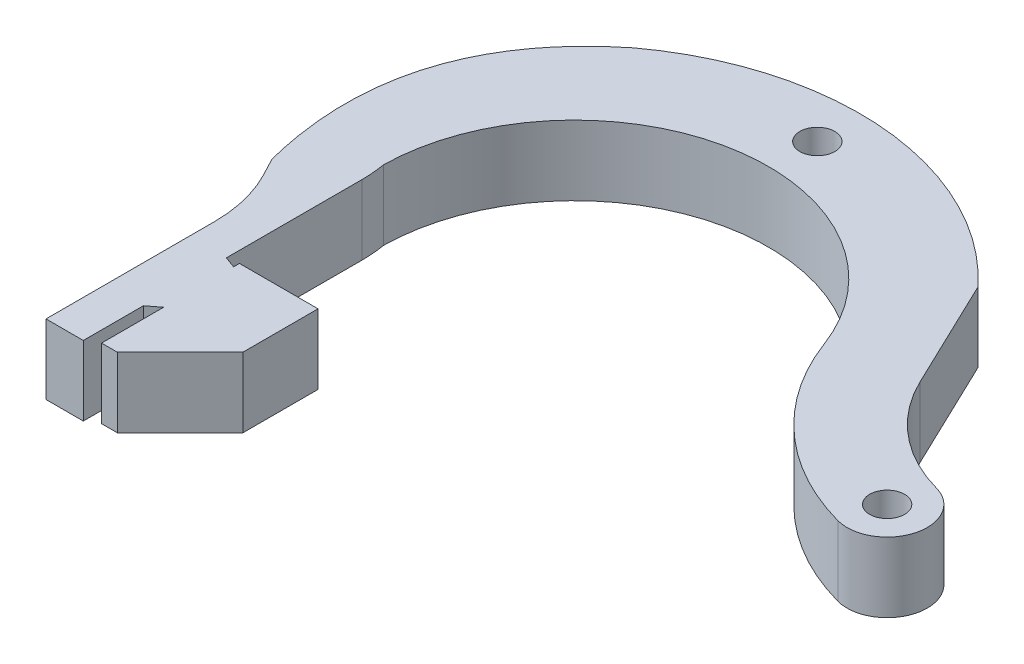
ISO-10303-21;
HEADER;
FILE_DESCRIPTION(('STEP AP214'),'2;1');
FILE_NAME('part.step','',(''),(''),'','','');
FILE_SCHEMA(('AUTOMOTIVE_DESIGN { 1 0 10303 214 1 1 1 1 }'));
ENDSEC;
DATA;
#1=APPLICATION_CONTEXT('core data for automotive mechanical design processes');
#2=APPLICATION_PROTOCOL_DEFINITION('international standard','automotive_design',2000,#1);
#3=PRODUCT_CONTEXT('',#1,'mechanical');
#4=PRODUCT('Part','Part','',(#3));
#5=PRODUCT_RELATED_PRODUCT_CATEGORY('part','',(#4));
#6=PRODUCT_DEFINITION_FORMATION('','',#4);
#7=PRODUCT_DEFINITION_CONTEXT('part definition',#1,'design');
#8=PRODUCT_DEFINITION('design','',#6,#7);
#9=PRODUCT_DEFINITION_SHAPE('','',#8);
#10=(LENGTH_UNIT() NAMED_UNIT(*) SI_UNIT(.MILLI.,.METRE.));
#11=(NAMED_UNIT(*) PLANE_ANGLE_UNIT() SI_UNIT($,.RADIAN.));
#12=(NAMED_UNIT(*) SI_UNIT($,.STERADIAN.) SOLID_ANGLE_UNIT());
#13=UNCERTAINTY_MEASURE_WITH_UNIT(LENGTH_MEASURE(1.E-05),#10,'distance_accuracy_value','');
#14=(GEOMETRIC_REPRESENTATION_CONTEXT(3) GLOBAL_UNCERTAINTY_ASSIGNED_CONTEXT((#13)) GLOBAL_UNIT_ASSIGNED_CONTEXT((#10,
#11,#12)) REPRESENTATION_CONTEXT('',''));
#15=CARTESIAN_POINT('',(0.,0.,0.));
#16=DIRECTION('',(0.,0.,1.));
#17=DIRECTION('',(1.,0.,0.));
#18=AXIS2_PLACEMENT_3D('',#15,#16,#17);
#19=CARTESIAN_POINT('',(-27.8836472437135,10.,9.98188058205765));
#20=DIRECTION('',(-1.,0.,0.));
#21=DIRECTION('',(0.,0.,1.));
#22=AXIS2_PLACEMENT_3D('',#19,#20,#21);
#23=PLANE('',#22);
#24=DIRECTION('',(0.,1.,0.));
#25=VECTOR('',#24,1.);
#26=CARTESIAN_POINT('',(-27.8836472437135,10.,-10.5070045772254));
#27=LINE('',#26,#25);
#28=CARTESIAN_POINT('',(-27.8836472437135,0.,-10.5070045772254));
#29=VERTEX_POINT('',#28);
#30=CARTESIAN_POINT('',(-27.8836472437135,10.,-10.5070045772254));
#31=VERTEX_POINT('',#30);
#32=EDGE_CURVE('E11',#29,#31,#27,.T.);
#33=ORIENTED_EDGE('',*,*,#32,.F.);
#34=DIRECTION('',(0.,0.,-1.));
#35=VECTOR('',#34,1.);
#36=CARTESIAN_POINT('',(-27.8836472437135,0.,9.98188058205765));
#37=LINE('',#36,#35);
#38=CARTESIAN_POINT('',(-27.8836472437135,0.,-29.9252817788235));
#39=VERTEX_POINT('',#38);
#40=EDGE_CURVE('E348',#29,#39,#37,.T.);
#41=ORIENTED_EDGE('',*,*,#40,.T.);
#42=DIRECTION('',(0.,-1.,0.));
#43=VECTOR('',#42,1.);
#44=CARTESIAN_POINT('',(-27.8836472437135,10.,-29.9252817788235));
#45=LINE('',#44,#43);
#46=CARTESIAN_POINT('',(-27.8836472437135,10.,-29.9252817788235));
#47=VERTEX_POINT('',#46);
#48=EDGE_CURVE('E352',#47,#39,#45,.T.);
#49=ORIENTED_EDGE('',*,*,#48,.F.);
#50=DIRECTION('',(0.,0.,-1.));
#51=VECTOR('',#50,1.);
#52=CARTESIAN_POINT('',(-27.8836472437135,10.,9.98188058205765));
#53=LINE('',#52,#51);
#54=EDGE_CURVE('E61',#31,#47,#53,.T.);
#55=ORIENTED_EDGE('',*,*,#54,.F.);
#56=EDGE_LOOP('',(#33,#41,#49,#55));
#57=FACE_BOUND('',#56,.T.);
#58=ADVANCED_FACE('F45',(#57),#23,.F.);
#59=DIRECTION('',(0.,-1.,0.));
#60=VECTOR('',#59,1.);
#61=CARTESIAN_POINT('',(-27.8836472437135,10.,1.36486148575647));
#62=LINE('',#61,#60);
#63=CARTESIAN_POINT('',(-27.8836472437135,10.,1.36486148575647));
#64=VERTEX_POINT('',#63);
#65=CARTESIAN_POINT('',(-27.8836472437135,0.,1.36486148575647));
#66=VERTEX_POINT('',#65);
#67=EDGE_CURVE('E54',#64,#66,#62,.T.);
#68=ORIENTED_EDGE('',*,*,#67,.F.);
#69=CARTESIAN_POINT('',(-27.8836472437135,10.,9.98188058205765));
#70=VERTEX_POINT('',#69);
#71=EDGE_CURVE('E255',#70,#64,#53,.T.);
#72=ORIENTED_EDGE('',*,*,#71,.F.);
#73=DIRECTION('',(0.,-1.,0.));
#74=VECTOR('',#73,1.);
#75=CARTESIAN_POINT('',(-27.8836472437135,10.,9.98188058205765));
#76=LINE('',#75,#74);
#77=CARTESIAN_POINT('',(-27.8836472437135,0.,9.98188058205765));
#78=VERTEX_POINT('',#77);
#79=EDGE_CURVE('E340',#70,#78,#76,.T.);
#80=ORIENTED_EDGE('',*,*,#79,.T.);
#81=EDGE_CURVE('E350',#78,#66,#37,.T.);
#82=ORIENTED_EDGE('',*,*,#81,.T.);
#83=EDGE_LOOP('',(#68,#72,#80,#82));
#84=FACE_BOUND('',#83,.T.);
#85=ADVANCED_FACE('F328',(#84),#23,.F.);
#86=CARTESIAN_POINT('',(-53.2263422322523,10.,-14.1708076967114));
#87=DIRECTION('',(0.,1.,0.));
#88=DIRECTION('',(0.,0.,1.));
#89=AXIS2_PLACEMENT_3D('',#86,#87,#88);
#90=PLANE('',#89);
#91=DIRECTION('',(-0.939615015171803,0.,-0.342233287778515));
#92=VECTOR('',#91,1.);
#93=CARTESIAN_POINT('',(-26.25,10.,-9.9119859171796));
#94=LINE('',#93,#92);
#95=CARTESIAN_POINT('',(-26.25,10.,-9.9119859171796));
#96=VERTEX_POINT('',#95);
#97=EDGE_CURVE('E195',#96,#31,#94,.T.);
#98=ORIENTED_EDGE('',*,*,#97,.T.);
#99=ORIENTED_EDGE('',*,*,#54,.T.);
#100=CARTESIAN_POINT('',(-47.8836472437136,10.,-29.9252817788235));
#101=DIRECTION('',(0.,1.,0.));
#102=DIRECTION('',(0.,0.,1.));
#103=AXIS2_PLACEMENT_3D('',#100,#101,#102);
#104=CIRCLE('',#103,20.);
#105=CARTESIAN_POINT('',(-28.1744901854838,10.,-33.3236825871495));
#106=VERTEX_POINT('',#105);
#107=EDGE_CURVE('E258',#47,#106,#104,.T.);
#108=ORIENTED_EDGE('',*,*,#107,.T.);
#109=CARTESIAN_POINT('',(-0.403753825224743,10.,-32.8879581539375));
#110=DIRECTION('',(0.,-1.,0.));
#111=DIRECTION('',(0.,0.,1.));
#112=AXIS2_PLACEMENT_3D('',#109,#110,#111);
#113=CIRCLE('',#112,27.7741544204808);
#114=CARTESIAN_POINT('',(25.6149759747366,10.,-42.6054348515848));
#115=VERTEX_POINT('',#114);
#116=EDGE_CURVE('E261',#106,#115,#113,.T.);
#117=ORIENTED_EDGE('',*,*,#116,.T.);
#118=CARTESIAN_POINT('',(57.4782918402877,10.,-54.5057478881469));
#119=DIRECTION('',(0.,1.,0.));
#120=DIRECTION('',(0.,0.,-1.));
#121=AXIS2_PLACEMENT_3D('',#118,#119,#120);
#122=CIRCLE('',#121,34.0130614369841);
#123=CARTESIAN_POINT('',(48.4785732367483,10.,-21.7049336700034));
#124=VERTEX_POINT('',#123);
#125=EDGE_CURVE('E264',#115,#124,#122,.T.);
#126=ORIENTED_EDGE('',*,*,#125,.T.);
#127=CARTESIAN_POINT('',(50.,10.,-27.25));
#128=DIRECTION('',(0.,1.,0.));
#129=DIRECTION('',(0.,0.,-1.));
#130=AXIS2_PLACEMENT_3D('',#127,#128,#129);
#131=CIRCLE('',#130,5.75);
#132=CARTESIAN_POINT('',(51.5214267632517,10.,-32.7950663299966));
#133=VERTEX_POINT('',#132);
#134=EDGE_CURVE('E267',#124,#133,#131,.T.);
#135=ORIENTED_EDGE('',*,*,#134,.T.);
#136=CARTESIAN_POINT('',(57.4782918402877,10.,-54.5057478881469));
#137=DIRECTION('',(0.,-1.,0.));
#138=DIRECTION('',(0.,0.,-1.));
#139=AXIS2_PLACEMENT_3D('',#136,#137,#138);
#140=CIRCLE('',#139,22.5130614369841);
#141=CARTESIAN_POINT('',(37.1739270964411,10.,-44.7810007133222));
#142=VERTEX_POINT('',#141);
#143=EDGE_CURVE('E270',#133,#142,#140,.T.);
#144=ORIENTED_EDGE('',*,*,#143,.T.);
#145=DIRECTION('',(-0.431960229045037,0.,-0.901892654656506));
#146=VECTOR('',#145,1.);
#147=CARTESIAN_POINT('',(37.1739270964411,10.,-44.7810007133222));
#148=LINE('',#147,#146);
#149=CARTESIAN_POINT('',(29.5444533086446,10.,-60.710630122308));
#150=VERTEX_POINT('',#149);
#151=EDGE_CURVE('E273',#142,#150,#148,.T.);
#152=ORIENTED_EDGE('',*,*,#151,.T.);
#153=CARTESIAN_POINT('',(-0.403753825224743,10.,-32.8879581539375));
#154=DIRECTION('',(0.,1.,0.));
#155=DIRECTION('',(0.,0.,1.));
#156=AXIS2_PLACEMENT_3D('',#153,#154,#155);
#157=CIRCLE('',#156,40.8778202206611);
#158=CARTESIAN_POINT('',(-24.8018942816884,10.,-65.6862344540628));
#159=VERTEX_POINT('',#158);
#160=EDGE_CURVE('E276',#150,#159,#157,.T.);
#161=ORIENTED_EDGE('',*,*,#160,.T.);
#162=CARTESIAN_POINT('',(-24.8018942816884,10.,-65.6862344540628));
#163=CARTESIAN_POINT('',(-43.2247945246152,10.,-50.9575823740122));
#164=CARTESIAN_POINT('',(-36.8668421446019,10.,-26.0214736730353));
#165=B_SPLINE_CURVE_WITH_KNOTS('',2,(#162,#163,#164),.UNSPECIFIED.,.F.,.F.,(3,3),(0.,1.),.UNSPECIFIED.);
#166=CARTESIAN_POINT('',(-36.8668421446019,10.,-26.0214736730353));
#167=VERTEX_POINT('',#166);
#168=EDGE_CURVE('E279',#159,#167,#165,.T.);
#169=ORIENTED_EDGE('',*,*,#168,.T.);
#170=DIRECTION('',(0.46691635712828,0.,0.884301484475773));
#171=VECTOR('',#170,1.);
#172=CARTESIAN_POINT('',(-35.5403125427369,10.,-23.509134839277));
#173=LINE('',#172,#171);
#174=CARTESIAN_POINT('',(-35.5403125427369,10.,-23.509134839277));
#175=VERTEX_POINT('',#174);
#176=EDGE_CURVE('E285',#167,#175,#173,.T.);
#177=ORIENTED_EDGE('',*,*,#176,.T.);
#178=CARTESIAN_POINT('',(-53.2263422322523,10.,-14.1708076967114));
#179=DIRECTION('',(0.,-1.,0.));
#180=DIRECTION('',(0.,0.,1.));
#181=AXIS2_PLACEMENT_3D('',#178,#179,#180);
#182=CIRCLE('',#181,20.);
#183=CARTESIAN_POINT('',(-33.2263422322523,10.,-14.1708076967113));
#184=VERTEX_POINT('',#183);
#185=EDGE_CURVE('E402',#175,#184,#182,.T.);
#186=ORIENTED_EDGE('',*,*,#185,.T.);
#187=DIRECTION('',(0.,0.,1.));
#188=VECTOR('',#187,1.);
#189=CARTESIAN_POINT('',(-33.2263422322523,10.,9.98188058205765));
#190=LINE('',#189,#188);
#191=CARTESIAN_POINT('',(-33.2263422322523,10.,9.98188058205765));
#192=VERTEX_POINT('',#191);
#193=EDGE_CURVE('E247',#184,#192,#190,.T.);
#194=ORIENTED_EDGE('',*,*,#193,.T.);
#195=DIRECTION('',(1.,0.,0.));
#196=VECTOR('',#195,1.);
#197=CARTESIAN_POINT('',(-33.2263422322523,10.,9.98188058205765));
#198=LINE('',#197,#196);
#199=EDGE_CURVE('E251',#192,#70,#198,.T.);
#200=ORIENTED_EDGE('',*,*,#199,.T.);
#201=ORIENTED_EDGE('',*,*,#71,.T.);
#202=DIRECTION('',(0.794045902338125,0.,-0.607857799966434));
#203=VECTOR('',#202,1.);
#204=CARTESIAN_POINT('',(-29.4384156793673,10.,2.55506738943392));
#205=LINE('',#204,#203);
#206=CARTESIAN_POINT('',(-26.25,10.,0.114272298707066));
#207=VERTEX_POINT('',#206);
#208=EDGE_CURVE('E204',#64,#207,#205,.T.);
#209=ORIENTED_EDGE('',*,*,#208,.T.);
#210=DIRECTION('',(0.,0.,1.));
#211=VECTOR('',#210,1.);
#212=CARTESIAN_POINT('',(-26.25,10.,9.));
#213=LINE('',#212,#211);
#214=CARTESIAN_POINT('',(-26.25,10.,9.));
#215=VERTEX_POINT('',#214);
#216=EDGE_CURVE('E449',#207,#215,#213,.T.);
#217=ORIENTED_EDGE('',*,*,#216,.T.);
#218=DIRECTION('',(1.,0.,0.));
#219=VECTOR('',#218,1.);
#220=CARTESIAN_POINT('',(-23.984756922729,10.,9.));
#221=LINE('',#220,#219);
#222=CARTESIAN_POINT('',(-23.984756922729,10.,9.));
#223=VERTEX_POINT('',#222);
#224=EDGE_CURVE('E452',#215,#223,#221,.T.);
#225=ORIENTED_EDGE('',*,*,#224,.T.);
#226=DIRECTION('',(0.706507215278727,0.,-0.707705839144414));
#227=VECTOR('',#226,1.);
#228=CARTESIAN_POINT('',(-15.,10.,0.));
#229=LINE('',#228,#227);
#230=CARTESIAN_POINT('',(-15.,10.,0.));
#231=VERTEX_POINT('',#230);
#232=EDGE_CURVE('E457',#223,#231,#229,.T.);
#233=ORIENTED_EDGE('',*,*,#232,.T.);
#234=DIRECTION('',(0.,0.,-1.));
#235=VECTOR('',#234,1.);
#236=CARTESIAN_POINT('',(-15.,10.,-10.75));
#237=LINE('',#236,#235);
#238=CARTESIAN_POINT('',(-15.,10.,-10.75));
#239=VERTEX_POINT('',#238);
#240=EDGE_CURVE('E460',#231,#239,#237,.T.);
#241=ORIENTED_EDGE('',*,*,#240,.T.);
#242=DIRECTION('',(-1.,0.,0.));
#243=VECTOR('',#242,1.);
#244=CARTESIAN_POINT('',(-26.25,10.,-10.75));
#245=LINE('',#244,#243);
#246=CARTESIAN_POINT('',(-26.25,10.,-10.75));
#247=VERTEX_POINT('',#246);
#248=EDGE_CURVE('E211',#239,#247,#245,.T.);
#249=ORIENTED_EDGE('',*,*,#248,.T.);
#250=DIRECTION('',(0.,0.,1.));
#251=VECTOR('',#250,1.);
#252=CARTESIAN_POINT('',(-26.25,10.,-10.75));
#253=LINE('',#252,#251);
#254=EDGE_CURVE('E205',#247,#96,#253,.T.);
#255=ORIENTED_EDGE('',*,*,#254,.T.);
#256=EDGE_LOOP('',(#98,#99,#108,#117,#126,#135,#144,#152,#161,#169,#177,#186,#194,#200,#201,
#209,#217,#225,#233,#241,#249,#255));
#257=FACE_BOUND('',#256,.T.);
#258=CARTESIAN_POINT('',(0.,10.,-67.25));
#259=DIRECTION('',(0.,1.,0.));
#260=DIRECTION('',(0.,0.,1.));
#261=AXIS2_PLACEMENT_3D('',#258,#259,#260);
#262=CIRCLE('',#261,2.5);
#263=CARTESIAN_POINT('',(0.,10.,-64.75));
#264=VERTEX_POINT('',#263);
#265=EDGE_CURVE('E239',#264,#264,#262,.T.);
#266=ORIENTED_EDGE('',*,*,#265,.F.);
#267=EDGE_LOOP('',(#266));
#268=FACE_BOUND('',#267,.T.);
#269=CARTESIAN_POINT('',(50.,10.,-27.25));
#270=DIRECTION('',(0.,1.,0.));
#271=DIRECTION('',(0.,0.,1.));
#272=AXIS2_PLACEMENT_3D('',#269,#270,#271);
#273=CIRCLE('',#272,2.5);
#274=CARTESIAN_POINT('',(50.,10.,-24.75));
#275=VERTEX_POINT('',#274);
#276=EDGE_CURVE('E228',#275,#275,#273,.T.);
#277=ORIENTED_EDGE('',*,*,#276,.F.);
#278=EDGE_LOOP('',(#277));
#279=FACE_BOUND('',#278,.T.);
#280=ADVANCED_FACE('F208',(#257,#268,#279),#90,.T.);
#281=CARTESIAN_POINT('',(-53.2263422322523,0.,-14.1708076967114));
#282=DIRECTION('',(0.,1.,0.));
#283=DIRECTION('',(0.,0.,1.));
#284=AXIS2_PLACEMENT_3D('',#281,#282,#283);
#285=PLANE('',#284);
#286=ORIENTED_EDGE('',*,*,#40,.F.);
#287=DIRECTION('',(-0.939615015171803,0.,-0.342233287778515));
#288=VECTOR('',#287,1.);
#289=CARTESIAN_POINT('',(-26.25,0.,-9.9119859171796));
#290=LINE('',#289,#288);
#291=CARTESIAN_POINT('',(-26.25,0.,-9.9119859171796));
#292=VERTEX_POINT('',#291);
#293=EDGE_CURVE('E468',#292,#29,#290,.T.);
#294=ORIENTED_EDGE('',*,*,#293,.F.);
#295=DIRECTION('',(0.,0.,1.));
#296=VECTOR('',#295,1.);
#297=CARTESIAN_POINT('',(-26.25,0.,-10.75));
#298=LINE('',#297,#296);
#299=CARTESIAN_POINT('',(-26.25,0.,-10.75));
#300=VERTEX_POINT('',#299);
#301=EDGE_CURVE('E220',#300,#292,#298,.T.);
#302=ORIENTED_EDGE('',*,*,#301,.F.);
#303=DIRECTION('',(-1.,0.,0.));
#304=VECTOR('',#303,1.);
#305=CARTESIAN_POINT('',(-26.25,0.,-10.75));
#306=LINE('',#305,#304);
#307=CARTESIAN_POINT('',(-15.,0.,-10.75));
#308=VERTEX_POINT('',#307);
#309=EDGE_CURVE('E216',#308,#300,#306,.T.);
#310=ORIENTED_EDGE('',*,*,#309,.F.);
#311=DIRECTION('',(0.,0.,-1.));
#312=VECTOR('',#311,1.);
#313=CARTESIAN_POINT('',(-15.,0.,-10.75));
#314=LINE('',#313,#312);
#315=CARTESIAN_POINT('',(-15.,0.,0.));
#316=VERTEX_POINT('',#315);
#317=EDGE_CURVE('E482',#316,#308,#314,.T.);
#318=ORIENTED_EDGE('',*,*,#317,.F.);
#319=DIRECTION('',(0.706507215278727,0.,-0.707705839144414));
#320=VECTOR('',#319,1.);
#321=CARTESIAN_POINT('',(-15.,0.,0.));
#322=LINE('',#321,#320);
#323=CARTESIAN_POINT('',(-23.984756922729,0.,9.));
#324=VERTEX_POINT('',#323);
#325=EDGE_CURVE('E479',#324,#316,#322,.T.);
#326=ORIENTED_EDGE('',*,*,#325,.F.);
#327=DIRECTION('',(1.,0.,0.));
#328=VECTOR('',#327,1.);
#329=CARTESIAN_POINT('',(-23.984756922729,0.,9.));
#330=LINE('',#329,#328);
#331=CARTESIAN_POINT('',(-26.25,0.,9.));
#332=VERTEX_POINT('',#331);
#333=EDGE_CURVE('E476',#332,#324,#330,.T.);
#334=ORIENTED_EDGE('',*,*,#333,.F.);
#335=DIRECTION('',(0.,0.,1.));
#336=VECTOR('',#335,1.);
#337=CARTESIAN_POINT('',(-26.25,0.,9.));
#338=LINE('',#337,#336);
#339=CARTESIAN_POINT('',(-26.25,0.,0.114272298707066));
#340=VERTEX_POINT('',#339);
#341=EDGE_CURVE('E473',#340,#332,#338,.T.);
#342=ORIENTED_EDGE('',*,*,#341,.F.);
#343=DIRECTION('',(0.794045902338125,0.,-0.607857799966434));
#344=VECTOR('',#343,1.);
#345=CARTESIAN_POINT('',(-29.4384156793673,0.,2.55506738943392));
#346=LINE('',#345,#344);
#347=EDGE_CURVE('E357',#66,#340,#346,.T.);
#348=ORIENTED_EDGE('',*,*,#347,.F.);
#349=ORIENTED_EDGE('',*,*,#81,.F.);
#350=DIRECTION('',(1.,0.,0.));
#351=VECTOR('',#350,1.);
#352=CARTESIAN_POINT('',(-33.2263422322523,0.,9.98188058205765));
#353=LINE('',#352,#351);
#354=CARTESIAN_POINT('',(-33.2263422322523,0.,9.98188058205765));
#355=VERTEX_POINT('',#354);
#356=EDGE_CURVE('E338',#355,#78,#353,.T.);
#357=ORIENTED_EDGE('',*,*,#356,.F.);
#358=DIRECTION('',(0.,0.,1.));
#359=VECTOR('',#358,1.);
#360=CARTESIAN_POINT('',(-33.2263422322523,0.,9.98188058205765));
#361=LINE('',#360,#359);
#362=CARTESIAN_POINT('',(-33.2263422322523,0.,-14.1708076967113));
#363=VERTEX_POINT('',#362);
#364=EDGE_CURVE('E243',#363,#355,#361,.T.);
#365=ORIENTED_EDGE('',*,*,#364,.F.);
#366=CARTESIAN_POINT('',(-53.2263422322523,0.,-14.1708076967114));
#367=DIRECTION('',(0.,-1.,0.));
#368=DIRECTION('',(0.,0.,1.));
#369=AXIS2_PLACEMENT_3D('',#366,#367,#368);
#370=CIRCLE('',#369,20.);
#371=CARTESIAN_POINT('',(-35.5403125427369,0.,-23.509134839277));
#372=VERTEX_POINT('',#371);
#373=EDGE_CURVE('E252',#372,#363,#370,.T.);
#374=ORIENTED_EDGE('',*,*,#373,.F.);
#375=DIRECTION('',(0.46691635712828,0.,0.884301484475773));
#376=VECTOR('',#375,1.);
#377=CARTESIAN_POINT('',(-35.5403125427369,0.,-23.509134839277));
#378=LINE('',#377,#376);
#379=CARTESIAN_POINT('',(-36.8668421446019,0.,-26.0214736730353));
#380=VERTEX_POINT('',#379);
#381=EDGE_CURVE('E389',#380,#372,#378,.T.);
#382=ORIENTED_EDGE('',*,*,#381,.F.);
#383=CARTESIAN_POINT('',(-24.8018942816884,0.,-65.6862344540628));
#384=CARTESIAN_POINT('',(-43.2247945246152,0.,-50.9575823740122));
#385=CARTESIAN_POINT('',(-36.8668421446019,0.,-26.0214736730353));
#386=B_SPLINE_CURVE_WITH_KNOTS('',2,(#383,#384,#385),.UNSPECIFIED.,.F.,.F.,(3,3),(0.,1.),.UNSPECIFIED.);
#387=CARTESIAN_POINT('',(-24.8018942816884,0.,-65.6862344540628));
#388=VERTEX_POINT('',#387);
#389=EDGE_CURVE('E384',#388,#380,#386,.T.);
#390=ORIENTED_EDGE('',*,*,#389,.F.);
#391=CARTESIAN_POINT('',(-0.403753825224743,0.,-32.8879581539375));
#392=DIRECTION('',(0.,1.,0.));
#393=DIRECTION('',(0.,0.,1.));
#394=AXIS2_PLACEMENT_3D('',#391,#392,#393);
#395=CIRCLE('',#394,40.8778202206611);
#396=CARTESIAN_POINT('',(29.5444533086446,0.,-60.710630122308));
#397=VERTEX_POINT('',#396);
#398=EDGE_CURVE('E381',#397,#388,#395,.T.);
#399=ORIENTED_EDGE('',*,*,#398,.F.);
#400=DIRECTION('',(-0.431960229045037,0.,-0.901892654656506));
#401=VECTOR('',#400,1.);
#402=CARTESIAN_POINT('',(37.1739270964411,0.,-44.7810007133222));
#403=LINE('',#402,#401);
#404=CARTESIAN_POINT('',(37.1739270964411,0.,-44.7810007133222));
#405=VERTEX_POINT('',#404);
#406=EDGE_CURVE('E378',#405,#397,#403,.T.);
#407=ORIENTED_EDGE('',*,*,#406,.F.);
#408=CARTESIAN_POINT('',(57.4782918402877,0.,-54.5057478881469));
#409=DIRECTION('',(0.,-1.,0.));
#410=DIRECTION('',(0.,0.,-1.));
#411=AXIS2_PLACEMENT_3D('',#408,#409,#410);
#412=CIRCLE('',#411,22.5130614369841);
#413=CARTESIAN_POINT('',(51.5214267632517,0.,-32.7950663299966));
#414=VERTEX_POINT('',#413);
#415=EDGE_CURVE('E375',#414,#405,#412,.T.);
#416=ORIENTED_EDGE('',*,*,#415,.F.);
#417=CARTESIAN_POINT('',(50.,0.,-27.25));
#418=DIRECTION('',(0.,1.,0.));
#419=DIRECTION('',(0.,0.,-1.));
#420=AXIS2_PLACEMENT_3D('',#417,#418,#419);
#421=CIRCLE('',#420,5.75);
#422=CARTESIAN_POINT('',(48.4785732367483,0.,-21.7049336700034));
#423=VERTEX_POINT('',#422);
#424=EDGE_CURVE('E372',#423,#414,#421,.T.);
#425=ORIENTED_EDGE('',*,*,#424,.F.);
#426=CARTESIAN_POINT('',(57.4782918402877,0.,-54.5057478881469));
#427=DIRECTION('',(0.,1.,0.));
#428=DIRECTION('',(0.,0.,-1.));
#429=AXIS2_PLACEMENT_3D('',#426,#427,#428);
#430=CIRCLE('',#429,34.0130614369841);
#431=CARTESIAN_POINT('',(25.6149759747366,0.,-42.6054348515848));
#432=VERTEX_POINT('',#431);
#433=EDGE_CURVE('E369',#432,#423,#430,.T.);
#434=ORIENTED_EDGE('',*,*,#433,.F.);
#435=CARTESIAN_POINT('',(-0.403753825224743,0.,-32.8879581539375));
#436=DIRECTION('',(0.,-1.,0.));
#437=DIRECTION('',(0.,0.,1.));
#438=AXIS2_PLACEMENT_3D('',#435,#436,#437);
#439=CIRCLE('',#438,27.7741544204808);
#440=CARTESIAN_POINT('',(-28.1744901854838,0.,-33.3236825871495));
#441=VERTEX_POINT('',#440);
#442=EDGE_CURVE('E363',#441,#432,#439,.T.);
#443=ORIENTED_EDGE('',*,*,#442,.F.);
#444=CARTESIAN_POINT('',(-47.8836472437136,0.,-29.9252817788235));
#445=DIRECTION('',(0.,1.,0.));
#446=DIRECTION('',(0.,0.,1.));
#447=AXIS2_PLACEMENT_3D('',#444,#445,#446);
#448=CIRCLE('',#447,20.);
#449=EDGE_CURVE('E359',#39,#441,#448,.T.);
#450=ORIENTED_EDGE('',*,*,#449,.F.);
#451=EDGE_LOOP('',(#286,#294,#302,#310,#318,#326,#334,#342,#348,#349,#357,#365,#374,#382,#390,
#399,#407,#416,#425,#434,#443,#450));
#452=FACE_BOUND('',#451,.T.);
#453=CARTESIAN_POINT('',(50.,0.,-27.25));
#454=DIRECTION('',(0.,1.,0.));
#455=DIRECTION('',(0.,0.,1.));
#456=AXIS2_PLACEMENT_3D('',#453,#454,#455);
#457=CIRCLE('',#456,2.5);
#458=CARTESIAN_POINT('',(50.,0.,-24.75));
#459=VERTEX_POINT('',#458);
#460=EDGE_CURVE('E222',#459,#459,#457,.T.);
#461=ORIENTED_EDGE('',*,*,#460,.T.);
#462=EDGE_LOOP('',(#461));
#463=FACE_BOUND('',#462,.T.);
#464=CARTESIAN_POINT('',(0.,0.,-67.25));
#465=DIRECTION('',(0.,1.,0.));
#466=DIRECTION('',(0.,0.,1.));
#467=AXIS2_PLACEMENT_3D('',#464,#465,#466);
#468=CIRCLE('',#467,2.5);
#469=CARTESIAN_POINT('',(0.,0.,-64.75));
#470=VERTEX_POINT('',#469);
#471=EDGE_CURVE('E237',#470,#470,#468,.T.);
#472=ORIENTED_EDGE('',*,*,#471,.T.);
#473=EDGE_LOOP('',(#472));
#474=FACE_BOUND('',#473,.T.);
#475=ADVANCED_FACE('F334',(#452,#463,#474),#285,.F.);
#476=CARTESIAN_POINT('',(-33.2263422322523,10.,9.98188058205765));
#477=DIRECTION('',(1.,0.,0.));
#478=DIRECTION('',(0.,0.,-1.));
#479=AXIS2_PLACEMENT_3D('',#476,#477,#478);
#480=PLANE('',#479);
#481=ORIENTED_EDGE('',*,*,#364,.T.);
#482=DIRECTION('',(0.,-1.,0.));
#483=VECTOR('',#482,1.);
#484=CARTESIAN_POINT('',(-33.2263422322523,10.,9.98188058205765));
#485=LINE('',#484,#483);
#486=EDGE_CURVE('E342',#192,#355,#485,.T.);
#487=ORIENTED_EDGE('',*,*,#486,.F.);
#488=ORIENTED_EDGE('',*,*,#193,.F.);
#489=DIRECTION('',(0.,-1.,0.));
#490=VECTOR('',#489,1.);
#491=CARTESIAN_POINT('',(-33.2263422322523,10.,-14.1708076967113));
#492=LINE('',#491,#490);
#493=EDGE_CURVE('E397',#184,#363,#492,.T.);
#494=ORIENTED_EDGE('',*,*,#493,.T.);
#495=EDGE_LOOP('',(#481,#487,#488,#494));
#496=FACE_BOUND('',#495,.T.);
#497=ADVANCED_FACE('F47',(#496),#480,.F.);
#498=CARTESIAN_POINT('',(-33.2263422322523,10.,9.98188058205765));
#499=DIRECTION('',(0.,0.,-1.));
#500=DIRECTION('',(-1.,0.,0.));
#501=AXIS2_PLACEMENT_3D('',#498,#499,#500);
#502=PLANE('',#501);
#503=ORIENTED_EDGE('',*,*,#356,.T.);
#504=ORIENTED_EDGE('',*,*,#79,.F.);
#505=ORIENTED_EDGE('',*,*,#199,.F.);
#506=ORIENTED_EDGE('',*,*,#486,.T.);
#507=EDGE_LOOP('',(#503,#504,#505,#506));
#508=FACE_BOUND('',#507,.T.);
#509=ADVANCED_FACE('F325',(#508),#502,.F.);
#510=CARTESIAN_POINT('',(-47.8836472437136,10.,-29.9252817788235));
#511=DIRECTION('',(0.,-1.,0.));
#512=DIRECTION('',(0.,0.,-1.));
#513=AXIS2_PLACEMENT_3D('',#510,#511,#512);
#514=CYLINDRICAL_SURFACE('',#513,20.);
#515=ORIENTED_EDGE('',*,*,#449,.T.);
#516=DIRECTION('',(0.,-1.,0.));
#517=VECTOR('',#516,1.);
#518=CARTESIAN_POINT('',(-28.1744901854838,10.,-33.3236825871495));
#519=LINE('',#518,#517);
#520=EDGE_CURVE('E434',#106,#441,#519,.T.);
#521=ORIENTED_EDGE('',*,*,#520,.F.);
#522=ORIENTED_EDGE('',*,*,#107,.F.);
#523=ORIENTED_EDGE('',*,*,#48,.T.);
#524=EDGE_LOOP('',(#515,#521,#522,#523));
#525=FACE_BOUND('',#524,.T.);
#526=ADVANCED_FACE('F321',(#525),#514,.T.);
#527=CARTESIAN_POINT('',(-0.403753825224743,10.,-32.8879581539375));
#528=DIRECTION('',(0.,-1.,0.));
#529=DIRECTION('',(0.,0.,-1.));
#530=AXIS2_PLACEMENT_3D('',#527,#528,#529);
#531=CYLINDRICAL_SURFACE('',#530,27.7741544204808);
#532=ORIENTED_EDGE('',*,*,#442,.T.);
#533=DIRECTION('',(0.,-1.,0.));
#534=VECTOR('',#533,1.);
#535=CARTESIAN_POINT('',(25.6149759747366,10.,-42.6054348515848));
#536=LINE('',#535,#534);
#537=EDGE_CURVE('E430',#115,#432,#536,.T.);
#538=ORIENTED_EDGE('',*,*,#537,.F.);
#539=ORIENTED_EDGE('',*,*,#116,.F.);
#540=ORIENTED_EDGE('',*,*,#520,.T.);
#541=EDGE_LOOP('',(#532,#538,#539,#540));
#542=FACE_BOUND('',#541,.T.);
#543=ADVANCED_FACE('F317',(#542),#531,.F.);
#544=CARTESIAN_POINT('',(57.4782918402877,10.,-54.5057478881469));
#545=DIRECTION('',(0.,-1.,0.));
#546=DIRECTION('',(0.,0.,-1.));
#547=AXIS2_PLACEMENT_3D('',#544,#545,#546);
#548=CYLINDRICAL_SURFACE('',#547,34.0130614369841);
#549=ORIENTED_EDGE('',*,*,#433,.T.);
#550=DIRECTION('',(0.,-1.,0.));
#551=VECTOR('',#550,1.);
#552=CARTESIAN_POINT('',(48.4785732367483,10.,-21.7049336700034));
#553=LINE('',#552,#551);
#554=EDGE_CURVE('E426',#124,#423,#553,.T.);
#555=ORIENTED_EDGE('',*,*,#554,.F.);
#556=ORIENTED_EDGE('',*,*,#125,.F.);
#557=ORIENTED_EDGE('',*,*,#537,.T.);
#558=EDGE_LOOP('',(#549,#555,#556,#557));
#559=FACE_BOUND('',#558,.T.);
#560=ADVANCED_FACE('F313',(#559),#548,.T.);
#561=CARTESIAN_POINT('',(50.,10.,-27.25));
#562=DIRECTION('',(0.,-1.,0.));
#563=DIRECTION('',(0.,0.,-1.));
#564=AXIS2_PLACEMENT_3D('',#561,#562,#563);
#565=CYLINDRICAL_SURFACE('',#564,5.75);
#566=ORIENTED_EDGE('',*,*,#424,.T.);
#567=DIRECTION('',(0.,-1.,0.));
#568=VECTOR('',#567,1.);
#569=CARTESIAN_POINT('',(51.5214267632517,10.,-32.7950663299966));
#570=LINE('',#569,#568);
#571=EDGE_CURVE('E422',#133,#414,#570,.T.);
#572=ORIENTED_EDGE('',*,*,#571,.F.);
#573=ORIENTED_EDGE('',*,*,#134,.F.);
#574=ORIENTED_EDGE('',*,*,#554,.T.);
#575=EDGE_LOOP('',(#566,#572,#573,#574));
#576=FACE_BOUND('',#575,.T.);
#577=ADVANCED_FACE('F309',(#576),#565,.T.);
#578=CARTESIAN_POINT('',(57.4782918402877,10.,-54.5057478881469));
#579=DIRECTION('',(0.,-1.,0.));
#580=DIRECTION('',(0.,0.,-1.));
#581=AXIS2_PLACEMENT_3D('',#578,#579,#580);
#582=CYLINDRICAL_SURFACE('',#581,22.5130614369841);
#583=ORIENTED_EDGE('',*,*,#415,.T.);
#584=DIRECTION('',(0.,-1.,0.));
#585=VECTOR('',#584,1.);
#586=CARTESIAN_POINT('',(37.1739270964411,10.,-44.7810007133222));
#587=LINE('',#586,#585);
#588=EDGE_CURVE('E418',#142,#405,#587,.T.);
#589=ORIENTED_EDGE('',*,*,#588,.F.);
#590=ORIENTED_EDGE('',*,*,#143,.F.);
#591=ORIENTED_EDGE('',*,*,#571,.T.);
#592=EDGE_LOOP('',(#583,#589,#590,#591));
#593=FACE_BOUND('',#592,.T.);
#594=ADVANCED_FACE('F305',(#593),#582,.F.);
#595=CARTESIAN_POINT('',(37.1739270964411,10.,-44.7810007133222));
#596=DIRECTION('',(-0.901892654656506,0.,0.431960229045037));
#597=DIRECTION('',(0.431960229045037,0.,0.901892654656506));
#598=AXIS2_PLACEMENT_3D('',#595,#596,#597);
#599=PLANE('',#598);
#600=ORIENTED_EDGE('',*,*,#406,.T.);
#601=DIRECTION('',(0.,-1.,0.));
#602=VECTOR('',#601,1.);
#603=CARTESIAN_POINT('',(29.5444533086446,10.,-60.710630122308));
#604=LINE('',#603,#602);
#605=EDGE_CURVE('E414',#150,#397,#604,.T.);
#606=ORIENTED_EDGE('',*,*,#605,.F.);
#607=ORIENTED_EDGE('',*,*,#151,.F.);
#608=ORIENTED_EDGE('',*,*,#588,.T.);
#609=EDGE_LOOP('',(#600,#606,#607,#608));
#610=FACE_BOUND('',#609,.T.);
#611=ADVANCED_FACE('F301',(#610),#599,.F.);
#612=CARTESIAN_POINT('',(-0.403753825224743,10.,-32.8879581539375));
#613=DIRECTION('',(0.,-1.,0.));
#614=DIRECTION('',(0.,0.,-1.));
#615=AXIS2_PLACEMENT_3D('',#612,#613,#614);
#616=CYLINDRICAL_SURFACE('',#615,40.8778202206611);
#617=ORIENTED_EDGE('',*,*,#398,.T.);
#618=DIRECTION('',(0.,-1.,0.));
#619=VECTOR('',#618,1.);
#620=CARTESIAN_POINT('',(-24.8018942816884,10.,-65.6862344540628));
#621=LINE('',#620,#619);
#622=EDGE_CURVE('E410',#159,#388,#621,.T.);
#623=ORIENTED_EDGE('',*,*,#622,.F.);
#624=ORIENTED_EDGE('',*,*,#160,.F.);
#625=ORIENTED_EDGE('',*,*,#605,.T.);
#626=EDGE_LOOP('',(#617,#623,#624,#625));
#627=FACE_BOUND('',#626,.T.);
#628=ADVANCED_FACE('F296',(#627),#616,.T.);
#629=DIRECTION('',(0.,-1.,0.));
#630=VECTOR('',#629,1.);
#631=SURFACE_OF_LINEAR_EXTRUSION('',#165,#630);
#632=ORIENTED_EDGE('',*,*,#389,.T.);
#633=DIRECTION('',(0.,-1.,0.));
#634=VECTOR('',#633,1.);
#635=CARTESIAN_POINT('',(-36.8668421446019,10.,-26.0214736730353));
#636=LINE('',#635,#634);
#637=EDGE_CURVE('E406',#167,#380,#636,.T.);
#638=ORIENTED_EDGE('',*,*,#637,.F.);
#639=ORIENTED_EDGE('',*,*,#168,.F.);
#640=ORIENTED_EDGE('',*,*,#622,.T.);
#641=EDGE_LOOP('',(#632,#638,#639,#640));
#642=FACE_BOUND('',#641,.T.);
#643=ADVANCED_FACE('F291',(#642),#631,.F.);
#644=CARTESIAN_POINT('',(-35.5403125427369,10.,-23.509134839277));
#645=DIRECTION('',(0.884301484475773,0.,-0.46691635712828));
#646=DIRECTION('',(-0.46691635712828,0.,-0.884301484475773));
#647=AXIS2_PLACEMENT_3D('',#644,#645,#646);
#648=PLANE('',#647);
#649=ORIENTED_EDGE('',*,*,#381,.T.);
#650=DIRECTION('',(0.,-1.,0.));
#651=VECTOR('',#650,1.);
#652=CARTESIAN_POINT('',(-35.5403125427369,10.,-23.509134839277));
#653=LINE('',#652,#651);
#654=EDGE_CURVE('E401',#175,#372,#653,.T.);
#655=ORIENTED_EDGE('',*,*,#654,.F.);
#656=ORIENTED_EDGE('',*,*,#176,.F.);
#657=ORIENTED_EDGE('',*,*,#637,.T.);
#658=EDGE_LOOP('',(#649,#655,#656,#657));
#659=FACE_BOUND('',#658,.T.);
#660=ADVANCED_FACE('F295',(#659),#648,.F.);
#661=CARTESIAN_POINT('',(-53.2263422322523,10.,-14.1708076967114));
#662=DIRECTION('',(0.,-1.,0.));
#663=DIRECTION('',(0.,0.,-1.));
#664=AXIS2_PLACEMENT_3D('',#661,#662,#663);
#665=CYLINDRICAL_SURFACE('',#664,20.);
#666=ORIENTED_EDGE('',*,*,#373,.T.);
#667=ORIENTED_EDGE('',*,*,#493,.F.);
#668=ORIENTED_EDGE('',*,*,#185,.F.);
#669=ORIENTED_EDGE('',*,*,#654,.T.);
#670=EDGE_LOOP('',(#666,#667,#668,#669));
#671=FACE_BOUND('',#670,.T.);
#672=ADVANCED_FACE('F542',(#671),#665,.F.);
#673=CARTESIAN_POINT('',(0.,10.,-67.25));
#674=DIRECTION('',(0.,-1.,0.));
#675=DIRECTION('',(0.,0.,-1.));
#676=AXIS2_PLACEMENT_3D('',#673,#674,#675);
#677=CYLINDRICAL_SURFACE('',#676,2.5);
#678=ORIENTED_EDGE('',*,*,#265,.T.);
#679=EDGE_LOOP('',(#678));
#680=FACE_BOUND('',#679,.T.);
#681=ORIENTED_EDGE('',*,*,#471,.F.);
#682=EDGE_LOOP('',(#681));
#683=FACE_BOUND('',#682,.T.);
#684=ADVANCED_FACE('F538',(#680,#683),#677,.F.);
#685=CARTESIAN_POINT('',(50.,10.,-27.25));
#686=DIRECTION('',(0.,-1.,0.));
#687=DIRECTION('',(0.,0.,-1.));
#688=AXIS2_PLACEMENT_3D('',#685,#686,#687);
#689=CYLINDRICAL_SURFACE('',#688,2.5);
#690=ORIENTED_EDGE('',*,*,#276,.T.);
#691=EDGE_LOOP('',(#690));
#692=FACE_BOUND('',#691,.T.);
#693=ORIENTED_EDGE('',*,*,#460,.F.);
#694=EDGE_LOOP('',(#693));
#695=FACE_BOUND('',#694,.T.);
#696=ADVANCED_FACE('F534',(#692,#695),#689,.F.);
#697=CARTESIAN_POINT('',(-26.25,10.,-9.9119859171796));
#698=DIRECTION('',(-0.342233287778515,0.,0.939615015171803));
#699=DIRECTION('',(0.939615015171803,0.,0.342233287778515));
#700=AXIS2_PLACEMENT_3D('',#697,#698,#699);
#701=PLANE('',#700);
#702=ORIENTED_EDGE('',*,*,#293,.T.);
#703=ORIENTED_EDGE('',*,*,#32,.T.);
#704=ORIENTED_EDGE('',*,*,#97,.F.);
#705=DIRECTION('',(0.,-1.,0.));
#706=VECTOR('',#705,1.);
#707=CARTESIAN_POINT('',(-26.25,10.,-9.9119859171796));
#708=LINE('',#707,#706);
#709=EDGE_CURVE('E200',#96,#292,#708,.T.);
#710=ORIENTED_EDGE('',*,*,#709,.T.);
#711=EDGE_LOOP('',(#702,#703,#704,#710));
#712=FACE_BOUND('',#711,.T.);
#713=ADVANCED_FACE('F198',(#712),#701,.F.);
#714=CARTESIAN_POINT('',(-29.4384156793673,10.,2.55506738943392));
#715=DIRECTION('',(-0.607857799966434,0.,-0.794045902338125));
#716=DIRECTION('',(-0.794045902338125,0.,0.607857799966434));
#717=AXIS2_PLACEMENT_3D('',#714,#715,#716);
#718=PLANE('',#717);
#719=ORIENTED_EDGE('',*,*,#208,.F.);
#720=ORIENTED_EDGE('',*,*,#67,.T.);
#721=ORIENTED_EDGE('',*,*,#347,.T.);
#722=DIRECTION('',(0.,-1.,0.));
#723=VECTOR('',#722,1.);
#724=CARTESIAN_POINT('',(-26.25,10.,0.114272298707066));
#725=LINE('',#724,#723);
#726=EDGE_CURVE('E223',#207,#340,#725,.T.);
#727=ORIENTED_EDGE('',*,*,#726,.F.);
#728=EDGE_LOOP('',(#719,#720,#721,#727));
#729=FACE_BOUND('',#728,.T.);
#730=ADVANCED_FACE('F445',(#729),#718,.F.);
#731=CARTESIAN_POINT('',(-26.25,10.,-10.75));
#732=DIRECTION('',(1.,0.,0.));
#733=DIRECTION('',(0.,0.,-1.));
#734=AXIS2_PLACEMENT_3D('',#731,#732,#733);
#735=PLANE('',#734);
#736=ORIENTED_EDGE('',*,*,#301,.T.);
#737=ORIENTED_EDGE('',*,*,#709,.F.);
#738=ORIENTED_EDGE('',*,*,#254,.F.);
#739=DIRECTION('',(0.,-1.,0.));
#740=VECTOR('',#739,1.);
#741=CARTESIAN_POINT('',(-26.25,10.,-10.75));
#742=LINE('',#741,#740);
#743=EDGE_CURVE('E465',#247,#300,#742,.T.);
#744=ORIENTED_EDGE('',*,*,#743,.T.);
#745=EDGE_LOOP('',(#736,#737,#738,#744));
#746=FACE_BOUND('',#745,.T.);
#747=ADVANCED_FACE('F218',(#746),#735,.F.);
#748=CARTESIAN_POINT('',(-26.25,10.,9.));
#749=DIRECTION('',(1.,0.,0.));
#750=DIRECTION('',(0.,0.,-1.));
#751=AXIS2_PLACEMENT_3D('',#748,#749,#750);
#752=PLANE('',#751);
#753=ORIENTED_EDGE('',*,*,#341,.T.);
#754=DIRECTION('',(0.,-1.,0.));
#755=VECTOR('',#754,1.);
#756=CARTESIAN_POINT('',(-26.25,10.,9.));
#757=LINE('',#756,#755);
#758=EDGE_CURVE('E231',#215,#332,#757,.T.);
#759=ORIENTED_EDGE('',*,*,#758,.F.);
#760=ORIENTED_EDGE('',*,*,#216,.F.);
#761=ORIENTED_EDGE('',*,*,#726,.T.);
#762=EDGE_LOOP('',(#753,#759,#760,#761));
#763=FACE_BOUND('',#762,.T.);
#764=ADVANCED_FACE('F520',(#763),#752,.F.);
#765=CARTESIAN_POINT('',(-23.984756922729,10.,9.));
#766=DIRECTION('',(0.,0.,-1.));
#767=DIRECTION('',(-1.,0.,0.));
#768=AXIS2_PLACEMENT_3D('',#765,#766,#767);
#769=PLANE('',#768);
#770=ORIENTED_EDGE('',*,*,#333,.T.);
#771=DIRECTION('',(0.,-1.,0.));
#772=VECTOR('',#771,1.);
#773=CARTESIAN_POINT('',(-23.984756922729,10.,9.));
#774=LINE('',#773,#772);
#775=EDGE_CURVE('E497',#223,#324,#774,.T.);
#776=ORIENTED_EDGE('',*,*,#775,.F.);
#777=ORIENTED_EDGE('',*,*,#224,.F.);
#778=ORIENTED_EDGE('',*,*,#758,.T.);
#779=EDGE_LOOP('',(#770,#776,#777,#778));
#780=FACE_BOUND('',#779,.T.);
#781=ADVANCED_FACE('F506',(#780),#769,.F.);
#782=CARTESIAN_POINT('',(-15.,10.,0.));
#783=DIRECTION('',(-0.707705839144414,0.,-0.706507215278727));
#784=DIRECTION('',(-0.706507215278727,0.,0.707705839144414));
#785=AXIS2_PLACEMENT_3D('',#782,#783,#784);
#786=PLANE('',#785);
#787=ORIENTED_EDGE('',*,*,#325,.T.);
#788=DIRECTION('',(0.,-1.,0.));
#789=VECTOR('',#788,1.);
#790=CARTESIAN_POINT('',(-15.,10.,0.));
#791=LINE('',#790,#789);
#792=EDGE_CURVE('E493',#231,#316,#791,.T.);
#793=ORIENTED_EDGE('',*,*,#792,.F.);
#794=ORIENTED_EDGE('',*,*,#232,.F.);
#795=ORIENTED_EDGE('',*,*,#775,.T.);
#796=EDGE_LOOP('',(#787,#793,#794,#795));
#797=FACE_BOUND('',#796,.T.);
#798=ADVANCED_FACE('F514',(#797),#786,.F.);
#799=CARTESIAN_POINT('',(-15.,10.,-10.75));
#800=DIRECTION('',(-1.,0.,0.));
#801=DIRECTION('',(0.,0.,1.));
#802=AXIS2_PLACEMENT_3D('',#799,#800,#801);
#803=PLANE('',#802);
#804=ORIENTED_EDGE('',*,*,#317,.T.);
#805=DIRECTION('',(0.,-1.,0.));
#806=VECTOR('',#805,1.);
#807=CARTESIAN_POINT('',(-15.,10.,-10.75));
#808=LINE('',#807,#806);
#809=EDGE_CURVE('E489',#239,#308,#808,.T.);
#810=ORIENTED_EDGE('',*,*,#809,.F.);
#811=ORIENTED_EDGE('',*,*,#240,.F.);
#812=ORIENTED_EDGE('',*,*,#792,.T.);
#813=EDGE_LOOP('',(#804,#810,#811,#812));
#814=FACE_BOUND('',#813,.T.);
#815=ADVANCED_FACE('F518',(#814),#803,.F.);
#816=CARTESIAN_POINT('',(-26.25,10.,-10.75));
#817=DIRECTION('',(0.,0.,1.));
#818=DIRECTION('',(1.,0.,0.));
#819=AXIS2_PLACEMENT_3D('',#816,#817,#818);
#820=PLANE('',#819);
#821=ORIENTED_EDGE('',*,*,#309,.T.);
#822=ORIENTED_EDGE('',*,*,#743,.F.);
#823=ORIENTED_EDGE('',*,*,#248,.F.);
#824=ORIENTED_EDGE('',*,*,#809,.T.);
#825=EDGE_LOOP('',(#821,#822,#823,#824));
#826=FACE_BOUND('',#825,.T.);
#827=ADVANCED_FACE('F588',(#826),#820,.F.);
#828=CLOSED_SHELL('',(#58,#85,#280,#475,#497,#509,#526,#543,#560,#577,#594,#611,#628,#643,#660,
#672,#684,#696,#713,#730,#747,#764,#781,#798,#815,#827));
#829=MANIFOLD_SOLID_BREP('B2',#828);
#830=ADVANCED_BREP_SHAPE_REPRESENTATION('',(#18,#829),#14);
#831=SHAPE_DEFINITION_REPRESENTATION(#9,#830);
ENDSEC;
END-ISO-10303-21;
